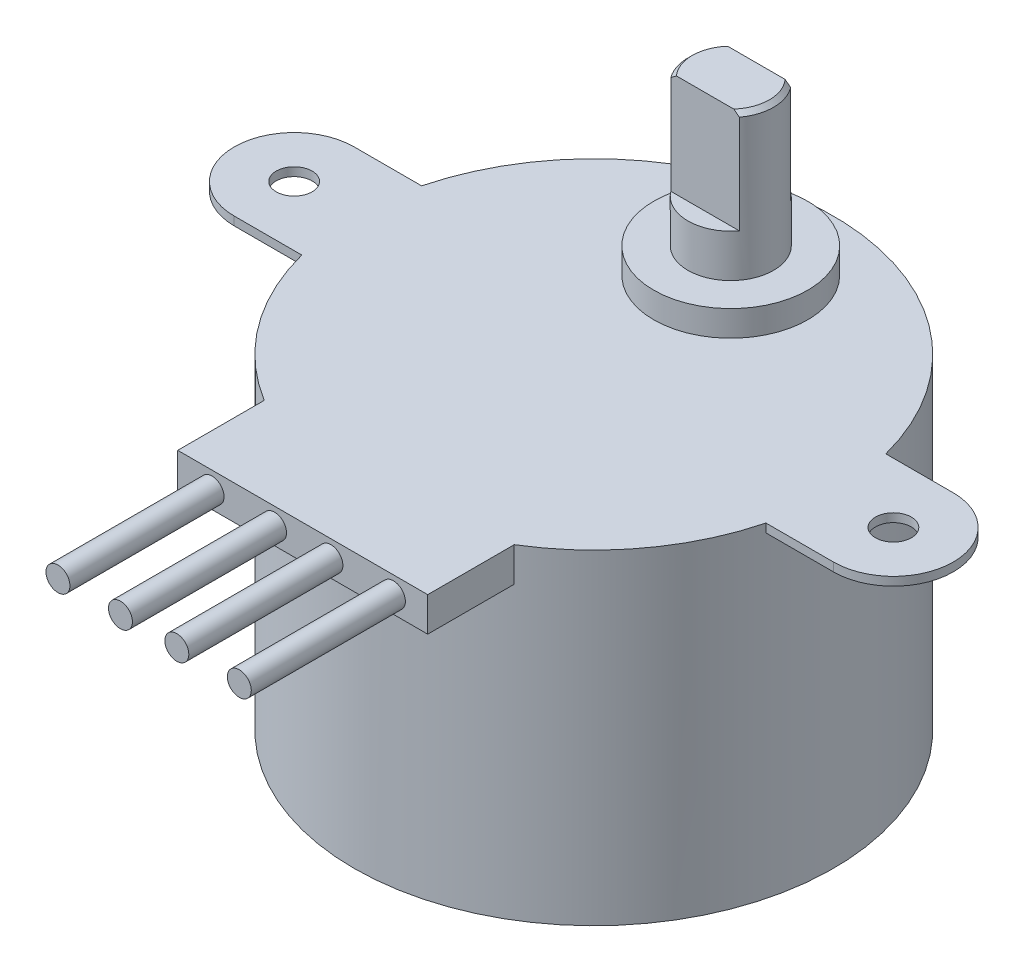
ISO-10303-21;
HEADER;
FILE_DESCRIPTION(('STEP AP214'),'2;1');
FILE_NAME('part.step','',(''),(''),'','','');
FILE_SCHEMA(('AUTOMOTIVE_DESIGN { 1 0 10303 214 1 1 1 1 }'));
ENDSEC;
DATA;
#1=APPLICATION_CONTEXT('core data for automotive mechanical design processes');
#2=APPLICATION_PROTOCOL_DEFINITION('international standard','automotive_design',2000,#1);
#3=PRODUCT_CONTEXT('',#1,'mechanical');
#4=PRODUCT('Part','Part','',(#3));
#5=PRODUCT_RELATED_PRODUCT_CATEGORY('part','',(#4));
#6=PRODUCT_DEFINITION_FORMATION('','',#4);
#7=PRODUCT_DEFINITION_CONTEXT('part definition',#1,'design');
#8=PRODUCT_DEFINITION('design','',#6,#7);
#9=PRODUCT_DEFINITION_SHAPE('','',#8);
#10=(LENGTH_UNIT() NAMED_UNIT(*) SI_UNIT(.MILLI.,.METRE.));
#11=(NAMED_UNIT(*) PLANE_ANGLE_UNIT() SI_UNIT($,.RADIAN.));
#12=(NAMED_UNIT(*) SI_UNIT($,.STERADIAN.) SOLID_ANGLE_UNIT());
#13=UNCERTAINTY_MEASURE_WITH_UNIT(LENGTH_MEASURE(1.E-05),#10,'distance_accuracy_value','');
#14=(GEOMETRIC_REPRESENTATION_CONTEXT(3) GLOBAL_UNCERTAINTY_ASSIGNED_CONTEXT((#13)) GLOBAL_UNIT_ASSIGNED_CONTEXT((#10,
#11,#12)) REPRESENTATION_CONTEXT('',''));
#15=CARTESIAN_POINT('',(0.,0.,0.));
#16=DIRECTION('',(0.,0.,1.));
#17=DIRECTION('',(1.,0.,0.));
#18=AXIS2_PLACEMENT_3D('',#15,#16,#17);
#19=CARTESIAN_POINT('',(0.,29.,-8.));
#20=DIRECTION('',(0.,-1.,0.));
#21=DIRECTION('',(0.,0.,-1.));
#22=AXIS2_PLACEMENT_3D('',#19,#20,#21);
#23=CONICAL_SURFACE('',#22,2.24999999999999,0.785398163397459);
#24=CARTESIAN_POINT('',(-5.29560570992025,25.7460523408249,-9.5));
#25=CARTESIAN_POINT('',(-5.18820658969202,25.849382940986,-9.5));
#26=CARTESIAN_POINT('',(-5.08069402352708,25.9525958192282,-9.5));
#27=CARTESIAN_POINT('',(-4.86538805530175,26.1587301210805,-9.5));
#28=CARTESIAN_POINT('',(-4.75759465073809,26.2616515420755,-9.5));
#29=CARTESIAN_POINT('',(-4.43364697867501,26.5699567070758,-9.5));
#30=CARTESIAN_POINT('',(-4.21699299986283,26.7748160360403,-9.5));
#31=CARTESIAN_POINT('',(-3.78327979432694,27.1809247429067,-9.5));
#32=CARTESIAN_POINT('',(-3.56623509437759,27.382189560473,-9.5));
#33=CARTESIAN_POINT('',(-3.23828667971139,27.6814511852117,-9.5));
#34=CARTESIAN_POINT('',(-3.12858082208436,27.7807594534206,-9.5));
#35=CARTESIAN_POINT('',(-2.90811369864988,27.9781960624543,-9.5));
#36=CARTESIAN_POINT('',(-2.79735245585084,28.0763244288972,-9.5));
#37=CARTESIAN_POINT('',(-2.6060781193075,28.243318134591,-9.5));
#38=CARTESIAN_POINT('',(-2.5259099046565,28.3125780774976,-9.5));
#39=CARTESIAN_POINT('',(-2.36465516134928,28.4500334343891,-9.5));
#40=CARTESIAN_POINT('',(-2.28356857525822,28.5182287811529,-9.5));
#41=CARTESIAN_POINT('',(-2.1198549226414,28.6535315064732,-9.5));
#42=CARTESIAN_POINT('',(-2.037222453965,28.720632368457,-9.5));
#43=CARTESIAN_POINT('',(-1.87045090712276,28.8529174798349,-9.5));
#44=CARTESIAN_POINT('',(-1.78631206308137,28.9181020229777,-9.5));
#45=CARTESIAN_POINT('',(-1.61535890214828,29.0463313053744,-9.5));
#46=CARTESIAN_POINT('',(-1.52852863031956,29.1093549069179,-9.5));
#47=CARTESIAN_POINT('',(-1.35207727598118,29.2315718346744,-9.5));
#48=CARTESIAN_POINT('',(-1.26245405394018,29.2907621119511,-9.5));
#49=CARTESIAN_POINT('',(-1.07992910258383,29.4030903725634,-9.5));
#50=CARTESIAN_POINT('',(-0.987041513790181,29.4562510471553,-9.5));
#51=CARTESIAN_POINT('',(-0.796653981553194,29.5535384191262,-9.5));
#52=CARTESIAN_POINT('',(-0.699162686771165,29.5976812866803,-9.5));
#53=CARTESIAN_POINT('',(-0.54802819699378,29.6537220566097,-9.5));
#54=CARTESIAN_POINT('',(-0.496323268659329,29.6708178403541,-9.5));
#55=CARTESIAN_POINT('',(-0.391626119819821,29.7005316333052,-9.5));
#56=CARTESIAN_POINT('',(-0.338634106406585,29.7131503578371,-9.5));
#57=CARTESIAN_POINT('',(-0.232037646161233,29.7330542925637,-9.5));
#58=CARTESIAN_POINT('',(-0.178440459717219,29.7403776373364,-9.5));
#59=CARTESIAN_POINT('',(-0.0707675976697622,29.7492893819139,-9.5));
#60=CARTESIAN_POINT('',(-0.0166919903199605,29.7508785869609,-9.5));
#61=CARTESIAN_POINT('',(0.0914656977030427,29.7481897112018,-9.5));
#62=CARTESIAN_POINT('',(0.145547348144287,29.7438947126811,-9.5));
#63=CARTESIAN_POINT('',(0.252974148158208,29.7297511472288,-9.5));
#64=CARTESIAN_POINT('',(0.306319141512227,29.7199014203182,-9.5));
#65=CARTESIAN_POINT('',(0.412272630736637,29.6952365228268,-9.5));
#66=CARTESIAN_POINT('',(0.464871941973378,29.6803826272461,-9.5));
#67=CARTESIAN_POINT('',(0.568710881944715,29.6465599429956,-9.5));
#68=CARTESIAN_POINT('',(0.61995043922586,29.6275909385603,-9.5));
#69=CARTESIAN_POINT('',(0.730427189428528,29.5825085207768,-9.5));
#70=CARTESIAN_POINT('',(0.789387325414205,29.555722573537,-9.5));
#71=CARTESIAN_POINT('',(0.905563799626151,29.4985758556907,-9.5));
#72=CARTESIAN_POINT('',(0.962779136826152,29.4682130798141,-9.5));
#73=CARTESIAN_POINT('',(1.0757708274364,29.4047101430363,-9.5));
#74=CARTESIAN_POINT('',(1.13154439115739,29.3715650582906,-9.5));
#75=CARTESIAN_POINT('',(1.24178698411766,29.3031634717541,-9.5));
#76=CARTESIAN_POINT('',(1.29625575153712,29.2679065510899,-9.5));
#77=CARTESIAN_POINT('',(1.45916596850069,29.1589339542868,-9.5));
#78=CARTESIAN_POINT('',(1.56592498003163,29.0827098755891,-9.5));
#79=CARTESIAN_POINT('',(1.7761813912377,28.9262240044225,-9.5));
#80=CARTESIAN_POINT('',(1.87968266356178,28.8459673252073,-9.5));
#81=CARTESIAN_POINT('',(2.05762102669724,28.7040741589505,-9.5));
#82=CARTESIAN_POINT('',(2.13256541352079,28.6430709074266,-9.5));
#83=CARTESIAN_POINT('',(2.28149035208902,28.5198991786782,-9.5));
#84=CARTESIAN_POINT('',(2.35547088679131,28.4577306808976,-9.5));
#85=CARTESIAN_POINT('',(2.57628628595803,28.2698615996696,-9.5));
#86=CARTESIAN_POINT('',(2.72197405035627,28.142814344787,-9.5));
#87=CARTESIAN_POINT('',(3.01147689149766,27.8862923788447,-9.5));
#88=CARTESIAN_POINT('',(3.15528966578232,27.7568150867017,-9.5));
#89=CARTESIAN_POINT('',(3.44147452884157,27.496302974234,-9.5));
#90=CARTESIAN_POINT('',(3.58384673104324,27.3652682783302,-9.5));
#91=CARTESIAN_POINT('',(3.85796590528941,27.1109819086724,-9.5));
#92=CARTESIAN_POINT('',(3.98978048387999,26.9878029598785,-9.5));
#93=CARTESIAN_POINT('',(4.25272725814049,26.7407129081771,-9.5));
#94=CARTESIAN_POINT('',(4.38385943690915,26.6168017872965,-9.5));
#95=CARTESIAN_POINT('',(4.64533491749975,26.3686645561344,-9.5));
#96=CARTESIAN_POINT('',(4.7756792639242,26.2444395455766,-9.5));
#97=CARTESIAN_POINT('',(5.03593786079116,25.9955492166926,-9.5));
#98=CARTESIAN_POINT('',(5.16585212683956,25.8708839146896,-9.5));
#99=CARTESIAN_POINT('',(5.29560570992025,25.7460523408249,-9.5));
#100=B_SPLINE_CURVE_WITH_KNOTS('',3,(#24,#25,#26,#27,#28,#29,#30,#31,#32,#33,#34,#35,#36,#37,
#38,#39,#40,#41,#42,#43,#44,#45,#46,#47,#48,#49,#50,#51,#52,#53,#54,#55,#56,#57,#58,#59,#60,#61,
#62,#63,#64,#65,#66,#67,#68,#69,#70,#71,#72,#73,#74,#75,#76,#77,#78,#79,#80,#81,#82,#83,#84,#85,
#86,#87,#88,#89,#90,#91,#92,#93,#94,#95,#96,#97,#98,#99),.UNSPECIFIED.,.F.,.F.,(4,2,2,2,2,2,2,2,
2,2,2,2,2,2,2,2,2,2,2,2,2,2,2,2,2,2,2,2,2,2,2,2,2,2,2,2,2,4),(0.,0.447108613703141,
0.894221226465639,1.78872876565463,2.67670064303386,3.12062914323221,3.56454798740258,
3.88236949475616,4.20021098960284,4.51952730253651,4.8387944101438,5.16060033890336,
5.48265915833049,5.80346266301834,6.12368577329955,6.28689941569178,6.45008696875854,
6.61208729704362,6.77406487482177,6.93650913407911,7.098987328701,7.2627529088567,
7.42652707772559,7.6206434256806,7.81486912329207,8.00944609630381,8.20406179141897,
8.59740753980443,8.99026653651387,9.28015313371083,9.57004484961505,10.1499089088741,
10.7304282916079,11.3109016043265,11.8521314065165,12.3933745503624,12.9335525857376,
13.4737108005205),.UNSPECIFIED.);
#101=CARTESIAN_POINT('',(-2.00000000000024,28.7499999999999,-9.5));
#102=VERTEX_POINT('',#101);
#103=CARTESIAN_POINT('',(-1.67705098312483,29.,-9.5));
#104=VERTEX_POINT('',#103);
#105=EDGE_CURVE('E480',#102,#104,#100,.T.);
#106=ORIENTED_EDGE('',*,*,#105,.F.);
#107=CARTESIAN_POINT('',(0.,28.75,-8.));
#108=DIRECTION('',(0.,1.,0.));
#109=DIRECTION('',(0.,0.,1.));
#110=AXIS2_PLACEMENT_3D('',#107,#108,#109);
#111=CIRCLE('',#110,2.5);
#112=CARTESIAN_POINT('',(-2.,28.75,-6.5));
#113=VERTEX_POINT('',#112);
#114=EDGE_CURVE('E367',#113,#102,#111,.F.);
#115=ORIENTED_EDGE('',*,*,#114,.F.);
#116=CARTESIAN_POINT('',(5.29560570992025,25.7460523408249,-6.5));
#117=CARTESIAN_POINT('',(5.18820658969202,25.849382940986,-6.5));
#118=CARTESIAN_POINT('',(5.08069402352708,25.9525958192282,-6.5));
#119=CARTESIAN_POINT('',(4.86538805530175,26.1587301210805,-6.5));
#120=CARTESIAN_POINT('',(4.75759465073809,26.2616515420755,-6.5));
#121=CARTESIAN_POINT('',(4.43364697867501,26.5699567070758,-6.5));
#122=CARTESIAN_POINT('',(4.21699299986283,26.7748160360403,-6.5));
#123=CARTESIAN_POINT('',(3.78327979432694,27.1809247429067,-6.5));
#124=CARTESIAN_POINT('',(3.56623509437759,27.382189560473,-6.5));
#125=CARTESIAN_POINT('',(3.23828667971139,27.6814511852117,-6.5));
#126=CARTESIAN_POINT('',(3.12858082208436,27.7807594534206,-6.5));
#127=CARTESIAN_POINT('',(2.90811369864988,27.9781960624543,-6.5));
#128=CARTESIAN_POINT('',(2.79735245585084,28.0763244288972,-6.5));
#129=CARTESIAN_POINT('',(2.6060781193075,28.243318134591,-6.5));
#130=CARTESIAN_POINT('',(2.5259099046565,28.3125780774976,-6.5));
#131=CARTESIAN_POINT('',(2.36465516134928,28.4500334343891,-6.5));
#132=CARTESIAN_POINT('',(2.28356857525822,28.5182287811529,-6.5));
#133=CARTESIAN_POINT('',(2.1198549226414,28.6535315064732,-6.5));
#134=CARTESIAN_POINT('',(2.037222453965,28.720632368457,-6.5));
#135=CARTESIAN_POINT('',(1.87045090712276,28.8529174798349,-6.5));
#136=CARTESIAN_POINT('',(1.78631206308137,28.9181020229777,-6.5));
#137=CARTESIAN_POINT('',(1.61535890214828,29.0463313053744,-6.5));
#138=CARTESIAN_POINT('',(1.52852863031956,29.1093549069179,-6.5));
#139=CARTESIAN_POINT('',(1.35207727598118,29.2315718346744,-6.5));
#140=CARTESIAN_POINT('',(1.26245405394018,29.2907621119511,-6.5));
#141=CARTESIAN_POINT('',(1.07992910258383,29.4030903725634,-6.5));
#142=CARTESIAN_POINT('',(0.987041513790181,29.4562510471553,-6.5));
#143=CARTESIAN_POINT('',(0.796653981553194,29.5535384191262,-6.5));
#144=CARTESIAN_POINT('',(0.699162686771165,29.5976812866803,-6.5));
#145=CARTESIAN_POINT('',(0.54802819699378,29.6537220566097,-6.5));
#146=CARTESIAN_POINT('',(0.496323268659329,29.6708178403541,-6.5));
#147=CARTESIAN_POINT('',(0.391626119819821,29.7005316333052,-6.5));
#148=CARTESIAN_POINT('',(0.338634106406585,29.7131503578371,-6.5));
#149=CARTESIAN_POINT('',(0.232037646161233,29.7330542925637,-6.5));
#150=CARTESIAN_POINT('',(0.178440459717219,29.7403776373364,-6.5));
#151=CARTESIAN_POINT('',(0.0707675976697622,29.7492893819139,-6.5));
#152=CARTESIAN_POINT('',(0.0166919903199605,29.7508785869609,-6.5));
#153=CARTESIAN_POINT('',(-0.0914656977030427,29.7481897112018,-6.5));
#154=CARTESIAN_POINT('',(-0.145547348144287,29.7438947126811,-6.5));
#155=CARTESIAN_POINT('',(-0.252974148158208,29.7297511472288,-6.5));
#156=CARTESIAN_POINT('',(-0.306319141512227,29.7199014203182,-6.5));
#157=CARTESIAN_POINT('',(-0.412272630736637,29.6952365228268,-6.5));
#158=CARTESIAN_POINT('',(-0.464871941973378,29.6803826272461,-6.5));
#159=CARTESIAN_POINT('',(-0.568710881944715,29.6465599429956,-6.5));
#160=CARTESIAN_POINT('',(-0.61995043922586,29.6275909385603,-6.5));
#161=CARTESIAN_POINT('',(-0.730427189428528,29.5825085207768,-6.5));
#162=CARTESIAN_POINT('',(-0.789387325414205,29.555722573537,-6.5));
#163=CARTESIAN_POINT('',(-0.905563799626151,29.4985758556907,-6.5));
#164=CARTESIAN_POINT('',(-0.962779136826152,29.4682130798141,-6.5));
#165=CARTESIAN_POINT('',(-1.0757708274364,29.4047101430363,-6.5));
#166=CARTESIAN_POINT('',(-1.13154439115739,29.3715650582906,-6.5));
#167=CARTESIAN_POINT('',(-1.24178698411766,29.3031634717541,-6.5));
#168=CARTESIAN_POINT('',(-1.29625575153712,29.2679065510899,-6.5));
#169=CARTESIAN_POINT('',(-1.45916596850069,29.1589339542868,-6.5));
#170=CARTESIAN_POINT('',(-1.56592498003163,29.0827098755891,-6.5));
#171=CARTESIAN_POINT('',(-1.7761813912377,28.9262240044225,-6.5));
#172=CARTESIAN_POINT('',(-1.87968266356178,28.8459673252073,-6.5));
#173=CARTESIAN_POINT('',(-2.05762102669724,28.7040741589505,-6.5));
#174=CARTESIAN_POINT('',(-2.13256541352079,28.6430709074266,-6.5));
#175=CARTESIAN_POINT('',(-2.28149035208902,28.5198991786782,-6.5));
#176=CARTESIAN_POINT('',(-2.35547088679131,28.4577306808976,-6.5));
#177=CARTESIAN_POINT('',(-2.57628628595803,28.2698615996696,-6.5));
#178=CARTESIAN_POINT('',(-2.72197405035627,28.142814344787,-6.5));
#179=CARTESIAN_POINT('',(-3.01147689149766,27.8862923788447,-6.5));
#180=CARTESIAN_POINT('',(-3.15528966578232,27.7568150867017,-6.5));
#181=CARTESIAN_POINT('',(-3.44147452884157,27.496302974234,-6.5));
#182=CARTESIAN_POINT('',(-3.58384673104324,27.3652682783302,-6.5));
#183=CARTESIAN_POINT('',(-3.85796590528941,27.1109819086724,-6.5));
#184=CARTESIAN_POINT('',(-3.98978048387999,26.9878029598785,-6.5));
#185=CARTESIAN_POINT('',(-4.25272725814049,26.7407129081771,-6.5));
#186=CARTESIAN_POINT('',(-4.38385943690915,26.6168017872965,-6.5));
#187=CARTESIAN_POINT('',(-4.64533491749975,26.3686645561344,-6.5));
#188=CARTESIAN_POINT('',(-4.7756792639242,26.2444395455766,-6.5));
#189=CARTESIAN_POINT('',(-5.03593786079116,25.9955492166926,-6.5));
#190=CARTESIAN_POINT('',(-5.16585212683956,25.8708839146896,-6.5));
#191=CARTESIAN_POINT('',(-5.29560570992025,25.7460523408249,-6.5));
#192=B_SPLINE_CURVE_WITH_KNOTS('',3,(#116,#117,#118,#119,#120,#121,#122,#123,#124,#125,#126,
#127,#128,#129,#130,#131,#132,#133,#134,#135,#136,#137,#138,#139,#140,#141,#142,#143,#144,#145,
#146,#147,#148,#149,#150,#151,#152,#153,#154,#155,#156,#157,#158,#159,#160,#161,#162,#163,#164,
#165,#166,#167,#168,#169,#170,#171,#172,#173,#174,#175,#176,#177,#178,#179,#180,#181,#182,#183,
#184,#185,#186,#187,#188,#189,#190,#191),.UNSPECIFIED.,.F.,.F.,(4,2,2,2,2,2,2,2,2,2,2,2,2,2,2,2,
2,2,2,2,2,2,2,2,2,2,2,2,2,2,2,2,2,2,2,2,2,4),(0.,0.447108613703141,0.894221226465639,
1.78872876565463,2.67670064303386,3.12062914323221,3.56454798740258,3.88236949475616,
4.20021098960284,4.51952730253651,4.8387944101438,5.16060033890336,5.48265915833049,
5.80346266301834,6.12368577329955,6.28689941569178,6.45008696875854,6.61208729704362,
6.77406487482177,6.93650913407911,7.098987328701,7.2627529088567,7.42652707772559,
7.6206434256806,7.81486912329207,8.00944609630381,8.20406179141897,8.59740753980443,
8.99026653651387,9.28015313371083,9.57004484961505,10.1499089088741,10.7304282916079,
11.3109016043265,11.8521314065165,12.3933745503624,12.9335525857376,13.4737108005205),.UNSPECIFIED.);
#193=CARTESIAN_POINT('',(-1.67705098312483,29.,-6.5));
#194=VERTEX_POINT('',#193);
#195=EDGE_CURVE('E371',#194,#113,#192,.T.);
#196=ORIENTED_EDGE('',*,*,#195,.F.);
#197=CARTESIAN_POINT('',(0.,29.,-8.));
#198=DIRECTION('',(0.,1.,0.));
#199=DIRECTION('',(0.,0.,1.));
#200=AXIS2_PLACEMENT_3D('',#197,#198,#199);
#201=CIRCLE('',#200,2.24999999999999);
#202=EDGE_CURVE('E344',#104,#194,#201,.T.);
#203=ORIENTED_EDGE('',*,*,#202,.F.);
#204=EDGE_LOOP('',(#106,#115,#196,#203));
#205=FACE_BOUND('',#204,.T.);
#206=ADVANCED_FACE('F41',(#205),#23,.T.);
#207=CARTESIAN_POINT('',(0.,19.,0.));
#208=DIRECTION('',(0.,-1.,0.));
#209=DIRECTION('',(0.,0.,-1.));
#210=AXIS2_PLACEMENT_3D('',#207,#208,#209);
#211=CYLINDRICAL_SURFACE('',#210,14.);
#212=CARTESIAN_POINT('',(0.,0.,0.));
#213=DIRECTION('',(0.,1.,0.));
#214=DIRECTION('',(0.,0.,1.));
#215=AXIS2_PLACEMENT_3D('',#212,#213,#214);
#216=CIRCLE('',#215,14.);
#217=CARTESIAN_POINT('',(0.,0.,14.));
#218=VERTEX_POINT('',#217);
#219=EDGE_CURVE('E350',#218,#218,#216,.T.);
#220=ORIENTED_EDGE('',*,*,#219,.T.);
#221=EDGE_LOOP('',(#220));
#222=FACE_BOUND('',#221,.T.);
#223=CARTESIAN_POINT('',(0.,17.,0.));
#224=DIRECTION('',(0.,-1.,0.));
#225=DIRECTION('',(0.,0.,-1.));
#226=AXIS2_PLACEMENT_3D('',#223,#224,#225);
#227=CIRCLE('',#226,14.);
#228=CARTESIAN_POINT('',(7.3,17.,11.9461290801665));
#229=VERTEX_POINT('',#228);
#230=CARTESIAN_POINT('',(-7.3,17.,11.9461290801665));
#231=VERTEX_POINT('',#230);
#232=EDGE_CURVE('E467',#229,#231,#227,.T.);
#233=ORIENTED_EDGE('',*,*,#232,.T.);
#234=DIRECTION('',(0.,-1.,0.));
#235=VECTOR('',#234,1.);
#236=CARTESIAN_POINT('',(-7.3,19.,11.9461290801665));
#237=LINE('',#236,#235);
#238=CARTESIAN_POINT('',(-7.3,19.,11.9461290801665));
#239=VERTEX_POINT('',#238);
#240=EDGE_CURVE('E175',#231,#239,#237,.F.);
#241=ORIENTED_EDGE('',*,*,#240,.T.);
#242=CARTESIAN_POINT('',(0.,19.,0.));
#243=DIRECTION('',(0.,1.,0.));
#244=DIRECTION('',(0.,0.,1.));
#245=AXIS2_PLACEMENT_3D('',#242,#243,#244);
#246=CIRCLE('',#245,14.);
#247=CARTESIAN_POINT('',(-13.555441711726,19.,3.5));
#248=VERTEX_POINT('',#247);
#249=EDGE_CURVE('E345',#248,#239,#246,.T.);
#250=ORIENTED_EDGE('',*,*,#249,.F.);
#251=DIRECTION('',(0.,1.,0.));
#252=VECTOR('',#251,1.);
#253=CARTESIAN_POINT('',(-13.555441711726,18.5,3.5));
#254=LINE('',#253,#252);
#255=CARTESIAN_POINT('',(-13.555441711726,18.5,3.5));
#256=VERTEX_POINT('',#255);
#257=EDGE_CURVE('E333',#256,#248,#254,.T.);
#258=ORIENTED_EDGE('',*,*,#257,.F.);
#259=CARTESIAN_POINT('',(0.,18.5,0.));
#260=DIRECTION('',(0.,1.,0.));
#261=DIRECTION('',(0.,0.,1.));
#262=AXIS2_PLACEMENT_3D('',#259,#260,#261);
#263=CIRCLE('',#262,14.);
#264=CARTESIAN_POINT('',(-13.555441711726,18.5,-3.5));
#265=VERTEX_POINT('',#264);
#266=EDGE_CURVE('E300',#265,#256,#263,.T.);
#267=ORIENTED_EDGE('',*,*,#266,.F.);
#268=DIRECTION('',(0.,1.,0.));
#269=VECTOR('',#268,1.);
#270=CARTESIAN_POINT('',(-13.555441711726,18.5,-3.5));
#271=LINE('',#270,#269);
#272=CARTESIAN_POINT('',(-13.555441711726,19.,-3.5));
#273=VERTEX_POINT('',#272);
#274=EDGE_CURVE('E329',#265,#273,#271,.T.);
#275=ORIENTED_EDGE('',*,*,#274,.T.);
#276=CARTESIAN_POINT('',(13.555441711726,19.,-3.5));
#277=VERTEX_POINT('',#276);
#278=EDGE_CURVE('E358',#277,#273,#246,.T.);
#279=ORIENTED_EDGE('',*,*,#278,.F.);
#280=DIRECTION('',(0.,1.,0.));
#281=VECTOR('',#280,1.);
#282=CARTESIAN_POINT('',(13.555441711726,18.5,-3.5));
#283=LINE('',#282,#281);
#284=CARTESIAN_POINT('',(13.555441711726,18.5,-3.5));
#285=VERTEX_POINT('',#284);
#286=EDGE_CURVE('E283',#285,#277,#283,.T.);
#287=ORIENTED_EDGE('',*,*,#286,.F.);
#288=CARTESIAN_POINT('',(0.,18.5,0.));
#289=DIRECTION('',(0.,1.,0.));
#290=DIRECTION('',(0.,0.,1.));
#291=AXIS2_PLACEMENT_3D('',#288,#289,#290);
#292=CIRCLE('',#291,14.);
#293=CARTESIAN_POINT('',(13.555441711726,18.5,3.5));
#294=VERTEX_POINT('',#293);
#295=EDGE_CURVE('E260',#294,#285,#292,.T.);
#296=ORIENTED_EDGE('',*,*,#295,.F.);
#297=DIRECTION('',(0.,1.,0.));
#298=VECTOR('',#297,1.);
#299=CARTESIAN_POINT('',(13.555441711726,18.5,3.5));
#300=LINE('',#299,#298);
#301=CARTESIAN_POINT('',(13.555441711726,19.,3.5));
#302=VERTEX_POINT('',#301);
#303=EDGE_CURVE('E278',#294,#302,#300,.T.);
#304=ORIENTED_EDGE('',*,*,#303,.T.);
#305=CARTESIAN_POINT('',(7.3,19.,11.9461290801665));
#306=VERTEX_POINT('',#305);
#307=EDGE_CURVE('E357',#306,#302,#246,.T.);
#308=ORIENTED_EDGE('',*,*,#307,.F.);
#309=DIRECTION('',(0.,-1.,0.));
#310=VECTOR('',#309,1.);
#311=CARTESIAN_POINT('',(7.3,19.,11.9461290801665));
#312=LINE('',#311,#310);
#313=EDGE_CURVE('E208',#306,#229,#312,.T.);
#314=ORIENTED_EDGE('',*,*,#313,.T.);
#315=EDGE_LOOP('',(#233,#241,#250,#258,#267,#275,#279,#287,#296,#304,#308,#314));
#316=FACE_BOUND('',#315,.T.);
#317=ADVANCED_FACE('F454',(#222,#316),#211,.T.);
#318=CARTESIAN_POINT('',(0.,19.,0.));
#319=DIRECTION('',(0.,1.,0.));
#320=DIRECTION('',(0.,0.,1.));
#321=AXIS2_PLACEMENT_3D('',#318,#319,#320);
#322=PLANE('',#321);
#323=ORIENTED_EDGE('',*,*,#249,.T.);
#324=DIRECTION('',(0.,0.,1.));
#325=VECTOR('',#324,1.);
#326=CARTESIAN_POINT('',(-7.3,19.,0.));
#327=LINE('',#326,#325);
#328=CARTESIAN_POINT('',(-7.3,19.,17.));
#329=VERTEX_POINT('',#328);
#330=EDGE_CURVE('E199',#239,#329,#327,.T.);
#331=ORIENTED_EDGE('',*,*,#330,.T.);
#332=DIRECTION('',(1.,0.,0.));
#333=VECTOR('',#332,1.);
#334=CARTESIAN_POINT('',(7.3,19.,17.));
#335=LINE('',#334,#333);
#336=CARTESIAN_POINT('',(7.3,19.,17.));
#337=VERTEX_POINT('',#336);
#338=EDGE_CURVE('E185',#329,#337,#335,.T.);
#339=ORIENTED_EDGE('',*,*,#338,.T.);
#340=DIRECTION('',(0.,0.,-1.));
#341=VECTOR('',#340,1.);
#342=CARTESIAN_POINT('',(7.3,19.,0.));
#343=LINE('',#342,#341);
#344=EDGE_CURVE('E58',#337,#306,#343,.T.);
#345=ORIENTED_EDGE('',*,*,#344,.T.);
#346=ORIENTED_EDGE('',*,*,#307,.T.);
#347=DIRECTION('',(-1.,0.,0.));
#348=VECTOR('',#347,1.);
#349=CARTESIAN_POINT('',(0.,19.,3.5));
#350=LINE('',#349,#348);
#351=CARTESIAN_POINT('',(17.5,19.,3.5));
#352=VERTEX_POINT('',#351);
#353=EDGE_CURVE('E267',#352,#302,#350,.T.);
#354=ORIENTED_EDGE('',*,*,#353,.F.);
#355=CARTESIAN_POINT('',(17.5,19.,0.));
#356=DIRECTION('',(0.,1.,0.));
#357=DIRECTION('',(0.,0.,1.));
#358=AXIS2_PLACEMENT_3D('',#355,#356,#357);
#359=CIRCLE('',#358,3.5);
#360=CARTESIAN_POINT('',(17.5,19.,-3.5));
#361=VERTEX_POINT('',#360);
#362=EDGE_CURVE('E271',#352,#361,#359,.T.);
#363=ORIENTED_EDGE('',*,*,#362,.T.);
#364=DIRECTION('',(1.,0.,0.));
#365=VECTOR('',#364,1.);
#366=CARTESIAN_POINT('',(0.,19.,-3.5));
#367=LINE('',#366,#365);
#368=EDGE_CURVE('E250',#277,#361,#367,.T.);
#369=ORIENTED_EDGE('',*,*,#368,.F.);
#370=ORIENTED_EDGE('',*,*,#278,.T.);
#371=DIRECTION('',(1.,0.,0.));
#372=VECTOR('',#371,1.);
#373=CARTESIAN_POINT('',(0.,19.,-3.5));
#374=LINE('',#373,#372);
#375=CARTESIAN_POINT('',(-17.5,19.,-3.5));
#376=VERTEX_POINT('',#375);
#377=EDGE_CURVE('E317',#376,#273,#374,.T.);
#378=ORIENTED_EDGE('',*,*,#377,.F.);
#379=CARTESIAN_POINT('',(-17.5,19.,0.));
#380=DIRECTION('',(0.,1.,0.));
#381=DIRECTION('',(0.,0.,1.));
#382=AXIS2_PLACEMENT_3D('',#379,#380,#381);
#383=CIRCLE('',#382,3.5);
#384=CARTESIAN_POINT('',(-17.5,19.,3.5));
#385=VERTEX_POINT('',#384);
#386=EDGE_CURVE('E282',#385,#376,#383,.F.);
#387=ORIENTED_EDGE('',*,*,#386,.F.);
#388=DIRECTION('',(-1.,0.,0.));
#389=VECTOR('',#388,1.);
#390=CARTESIAN_POINT('',(0.,19.,3.5));
#391=LINE('',#390,#389);
#392=EDGE_CURVE('E314',#248,#385,#391,.T.);
#393=ORIENTED_EDGE('',*,*,#392,.F.);
#394=EDGE_LOOP('',(#323,#331,#339,#345,#346,#354,#363,#369,#370,#378,#387,#393));
#395=FACE_BOUND('',#394,.T.);
#396=CARTESIAN_POINT('',(0.,19.,-8.));
#397=DIRECTION('',(0.,1.,0.));
#398=DIRECTION('',(0.,0.,1.));
#399=AXIS2_PLACEMENT_3D('',#396,#397,#398);
#400=CIRCLE('',#399,4.5);
#401=CARTESIAN_POINT('',(0.,19.,-3.5));
#402=VERTEX_POINT('',#401);
#403=EDGE_CURVE('E328',#402,#402,#400,.T.);
#404=ORIENTED_EDGE('',*,*,#403,.F.);
#405=EDGE_LOOP('',(#404));
#406=FACE_BOUND('',#405,.T.);
#407=CARTESIAN_POINT('',(-17.5,19.,0.));
#408=DIRECTION('',(0.,1.,0.));
#409=DIRECTION('',(0.,0.,1.));
#410=AXIS2_PLACEMENT_3D('',#407,#408,#409);
#411=CIRCLE('',#410,1.05);
#412=CARTESIAN_POINT('',(-17.5,19.,1.05));
#413=VERTEX_POINT('',#412);
#414=EDGE_CURVE('E297',#413,#413,#411,.F.);
#415=ORIENTED_EDGE('',*,*,#414,.T.);
#416=EDGE_LOOP('',(#415));
#417=FACE_BOUND('',#416,.T.);
#418=CARTESIAN_POINT('',(17.5,19.,0.));
#419=DIRECTION('',(0.,1.,0.));
#420=DIRECTION('',(0.,0.,1.));
#421=AXIS2_PLACEMENT_3D('',#418,#419,#420);
#422=CIRCLE('',#421,1.05);
#423=CARTESIAN_POINT('',(17.5,19.,1.05));
#424=VERTEX_POINT('',#423);
#425=EDGE_CURVE('E244',#424,#424,#422,.T.);
#426=ORIENTED_EDGE('',*,*,#425,.F.);
#427=EDGE_LOOP('',(#426));
#428=FACE_BOUND('',#427,.T.);
#429=ADVANCED_FACE('F451',(#395,#406,#417,#428),#322,.T.);
#430=CARTESIAN_POINT('',(0.,0.,0.));
#431=DIRECTION('',(0.,1.,0.));
#432=DIRECTION('',(0.,0.,1.));
#433=AXIS2_PLACEMENT_3D('',#430,#431,#432);
#434=PLANE('',#433);
#435=ORIENTED_EDGE('',*,*,#219,.F.);
#436=EDGE_LOOP('',(#435));
#437=FACE_BOUND('',#436,.T.);
#438=ADVANCED_FACE('F449',(#437),#434,.F.);
#439=CARTESIAN_POINT('',(0.,20.5,-8.));
#440=DIRECTION('',(0.,-1.,0.));
#441=DIRECTION('',(0.,0.,-1.));
#442=AXIS2_PLACEMENT_3D('',#439,#440,#441);
#443=CYLINDRICAL_SURFACE('',#442,4.5);
#444=CARTESIAN_POINT('',(0.,20.5,-8.));
#445=DIRECTION('',(0.,1.,0.));
#446=DIRECTION('',(0.,0.,1.));
#447=AXIS2_PLACEMENT_3D('',#444,#445,#446);
#448=CIRCLE('',#447,4.5);
#449=CARTESIAN_POINT('',(0.,20.5,-3.5));
#450=VERTEX_POINT('',#449);
#451=EDGE_CURVE('E346',#450,#450,#448,.T.);
#452=ORIENTED_EDGE('',*,*,#451,.F.);
#453=EDGE_LOOP('',(#452));
#454=FACE_BOUND('',#453,.T.);
#455=ORIENTED_EDGE('',*,*,#403,.T.);
#456=EDGE_LOOP('',(#455));
#457=FACE_BOUND('',#456,.T.);
#458=ADVANCED_FACE('F445',(#454,#457),#443,.T.);
#459=CARTESIAN_POINT('',(0.,20.5,-8.));
#460=DIRECTION('',(0.,1.,0.));
#461=DIRECTION('',(0.,0.,1.));
#462=AXIS2_PLACEMENT_3D('',#459,#460,#461);
#463=PLANE('',#462);
#464=CARTESIAN_POINT('',(0.,20.5,-8.));
#465=DIRECTION('',(0.,1.,0.));
#466=DIRECTION('',(0.,0.,1.));
#467=AXIS2_PLACEMENT_3D('',#464,#465,#466);
#468=CIRCLE('',#467,2.5);
#469=CARTESIAN_POINT('',(0.,20.5,-5.5));
#470=VERTEX_POINT('',#469);
#471=EDGE_CURVE('E340',#470,#470,#468,.T.);
#472=ORIENTED_EDGE('',*,*,#471,.F.);
#473=EDGE_LOOP('',(#472));
#474=FACE_BOUND('',#473,.T.);
#475=ORIENTED_EDGE('',*,*,#451,.T.);
#476=EDGE_LOOP('',(#475));
#477=FACE_BOUND('',#476,.T.);
#478=ADVANCED_FACE('F441',(#474,#477),#463,.T.);
#479=CARTESIAN_POINT('',(0.,23.,-8.));
#480=DIRECTION('',(0.,-1.,0.));
#481=DIRECTION('',(0.,0.,-1.));
#482=AXIS2_PLACEMENT_3D('',#479,#480,#481);
#483=CYLINDRICAL_SURFACE('',#482,2.5);
#484=ORIENTED_EDGE('',*,*,#114,.T.);
#485=DIRECTION('',(0.,-1.,0.));
#486=VECTOR('',#485,1.);
#487=CARTESIAN_POINT('',(-2.,23.,-9.5));
#488=LINE('',#487,#486);
#489=CARTESIAN_POINT('',(-2.,23.,-9.5));
#490=VERTEX_POINT('',#489);
#491=EDGE_CURVE('E240',#102,#490,#488,.T.);
#492=ORIENTED_EDGE('',*,*,#491,.T.);
#493=CARTESIAN_POINT('',(0.,23.,-8.));
#494=DIRECTION('',(0.,-1.,0.));
#495=DIRECTION('',(0.,0.,-1.));
#496=AXIS2_PLACEMENT_3D('',#493,#494,#495);
#497=CIRCLE('',#496,2.5);
#498=CARTESIAN_POINT('',(2.,23.,-9.5));
#499=VERTEX_POINT('',#498);
#500=EDGE_CURVE('E471',#490,#499,#497,.T.);
#501=ORIENTED_EDGE('',*,*,#500,.T.);
#502=DIRECTION('',(0.,-1.,0.));
#503=VECTOR('',#502,1.);
#504=CARTESIAN_POINT('',(2.,23.,-9.5));
#505=LINE('',#504,#503);
#506=CARTESIAN_POINT('',(2.,28.75,-9.5));
#507=VERTEX_POINT('',#506);
#508=EDGE_CURVE('E236',#499,#507,#505,.F.);
#509=ORIENTED_EDGE('',*,*,#508,.T.);
#510=CARTESIAN_POINT('',(2.00000000000024,28.7499999999999,-6.5));
#511=VERTEX_POINT('',#510);
#512=EDGE_CURVE('E366',#507,#511,#111,.F.);
#513=ORIENTED_EDGE('',*,*,#512,.T.);
#514=DIRECTION('',(0.,-1.,0.));
#515=VECTOR('',#514,1.);
#516=CARTESIAN_POINT('',(2.,23.,-6.5));
#517=LINE('',#516,#515);
#518=CARTESIAN_POINT('',(2.,23.,-6.5));
#519=VERTEX_POINT('',#518);
#520=EDGE_CURVE('E232',#511,#519,#517,.T.);
#521=ORIENTED_EDGE('',*,*,#520,.T.);
#522=CARTESIAN_POINT('',(0.,23.,-8.));
#523=DIRECTION('',(0.,1.,0.));
#524=DIRECTION('',(0.,0.,1.));
#525=AXIS2_PLACEMENT_3D('',#522,#523,#524);
#526=CIRCLE('',#525,2.5);
#527=CARTESIAN_POINT('',(-2.,23.,-6.5));
#528=VERTEX_POINT('',#527);
#529=EDGE_CURVE('E477',#528,#519,#526,.T.);
#530=ORIENTED_EDGE('',*,*,#529,.F.);
#531=DIRECTION('',(0.,-1.,0.));
#532=VECTOR('',#531,1.);
#533=CARTESIAN_POINT('',(-2.,23.,-6.5));
#534=LINE('',#533,#532);
#535=EDGE_CURVE('E219',#528,#113,#534,.F.);
#536=ORIENTED_EDGE('',*,*,#535,.T.);
#537=EDGE_LOOP('',(#484,#492,#501,#509,#513,#521,#530,#536));
#538=FACE_BOUND('',#537,.T.);
#539=ORIENTED_EDGE('',*,*,#471,.T.);
#540=EDGE_LOOP('',(#539));
#541=FACE_BOUND('',#540,.T.);
#542=ADVANCED_FACE('F437',(#538,#541),#483,.T.);
#543=CARTESIAN_POINT('',(0.,29.,-8.));
#544=DIRECTION('',(0.,1.,0.));
#545=DIRECTION('',(0.,0.,1.));
#546=AXIS2_PLACEMENT_3D('',#543,#544,#545);
#547=PLANE('',#546);
#548=DIRECTION('',(1.,0.,0.));
#549=VECTOR('',#548,1.);
#550=CARTESIAN_POINT('',(0.,29.,-9.5));
#551=LINE('',#550,#549);
#552=CARTESIAN_POINT('',(1.67705098312483,29.,-9.5));
#553=VERTEX_POINT('',#552);
#554=EDGE_CURVE('E220',#104,#553,#551,.T.);
#555=ORIENTED_EDGE('',*,*,#554,.F.);
#556=ORIENTED_EDGE('',*,*,#202,.T.);
#557=DIRECTION('',(-1.,0.,0.));
#558=VECTOR('',#557,1.);
#559=CARTESIAN_POINT('',(0.,29.,-6.5));
#560=LINE('',#559,#558);
#561=CARTESIAN_POINT('',(1.67705098312483,29.,-6.5));
#562=VERTEX_POINT('',#561);
#563=EDGE_CURVE('E66',#562,#194,#560,.T.);
#564=ORIENTED_EDGE('',*,*,#563,.F.);
#565=EDGE_CURVE('E362',#562,#553,#201,.T.);
#566=ORIENTED_EDGE('',*,*,#565,.T.);
#567=EDGE_LOOP('',(#555,#556,#564,#566));
#568=FACE_BOUND('',#567,.T.);
#569=ADVANCED_FACE('F434',(#568),#547,.T.);
#570=EDGE_CURVE('E380',#553,#507,#100,.T.);
#571=ORIENTED_EDGE('',*,*,#570,.F.);
#572=ORIENTED_EDGE('',*,*,#565,.F.);
#573=EDGE_CURVE('E379',#511,#562,#192,.T.);
#574=ORIENTED_EDGE('',*,*,#573,.F.);
#575=ORIENTED_EDGE('',*,*,#512,.F.);
#576=EDGE_LOOP('',(#571,#572,#574,#575));
#577=FACE_BOUND('',#576,.T.);
#578=ADVANCED_FACE('F43',(#577),#23,.T.);
#579=CARTESIAN_POINT('',(-17.5,18.5,0.));
#580=DIRECTION('',(0.,1.,0.));
#581=DIRECTION('',(0.,0.,1.));
#582=AXIS2_PLACEMENT_3D('',#579,#580,#581);
#583=CYLINDRICAL_SURFACE('',#582,3.5);
#584=ORIENTED_EDGE('',*,*,#386,.T.);
#585=DIRECTION('',(0.,1.,0.));
#586=VECTOR('',#585,1.);
#587=CARTESIAN_POINT('',(-17.5,18.5,-3.5));
#588=LINE('',#587,#586);
#589=CARTESIAN_POINT('',(-17.5,18.5,-3.5));
#590=VERTEX_POINT('',#589);
#591=EDGE_CURVE('E324',#590,#376,#588,.T.);
#592=ORIENTED_EDGE('',*,*,#591,.F.);
#593=CARTESIAN_POINT('',(-17.5,18.5,0.));
#594=DIRECTION('',(0.,1.,0.));
#595=DIRECTION('',(0.,0.,1.));
#596=AXIS2_PLACEMENT_3D('',#593,#594,#595);
#597=CIRCLE('',#596,3.5);
#598=CARTESIAN_POINT('',(-17.5,18.5,3.5));
#599=VERTEX_POINT('',#598);
#600=EDGE_CURVE('E292',#599,#590,#597,.F.);
#601=ORIENTED_EDGE('',*,*,#600,.F.);
#602=DIRECTION('',(0.,1.,0.));
#603=VECTOR('',#602,1.);
#604=CARTESIAN_POINT('',(-17.5,18.5,3.5));
#605=LINE('',#604,#603);
#606=EDGE_CURVE('E310',#599,#385,#605,.T.);
#607=ORIENTED_EDGE('',*,*,#606,.T.);
#608=EDGE_LOOP('',(#584,#592,#601,#607));
#609=FACE_BOUND('',#608,.T.);
#610=ADVANCED_FACE('F426',(#609),#583,.T.);
#611=CARTESIAN_POINT('',(0.,18.5,-3.5));
#612=DIRECTION('',(0.,0.,1.));
#613=DIRECTION('',(1.,0.,0.));
#614=AXIS2_PLACEMENT_3D('',#611,#612,#613);
#615=PLANE('',#614);
#616=ORIENTED_EDGE('',*,*,#377,.T.);
#617=ORIENTED_EDGE('',*,*,#274,.F.);
#618=DIRECTION('',(1.,0.,0.));
#619=VECTOR('',#618,1.);
#620=CARTESIAN_POINT('',(0.,18.5,-3.5));
#621=LINE('',#620,#619);
#622=EDGE_CURVE('E303',#590,#265,#621,.T.);
#623=ORIENTED_EDGE('',*,*,#622,.F.);
#624=ORIENTED_EDGE('',*,*,#591,.T.);
#625=EDGE_LOOP('',(#616,#617,#623,#624));
#626=FACE_BOUND('',#625,.T.);
#627=ADVANCED_FACE('F423',(#626),#615,.F.);
#628=CARTESIAN_POINT('',(0.,18.5,3.5));
#629=DIRECTION('',(0.,0.,-1.));
#630=DIRECTION('',(-1.,0.,0.));
#631=AXIS2_PLACEMENT_3D('',#628,#629,#630);
#632=PLANE('',#631);
#633=ORIENTED_EDGE('',*,*,#392,.T.);
#634=ORIENTED_EDGE('',*,*,#606,.F.);
#635=DIRECTION('',(-1.,0.,0.));
#636=VECTOR('',#635,1.);
#637=CARTESIAN_POINT('',(0.,18.5,3.5));
#638=LINE('',#637,#636);
#639=EDGE_CURVE('E296',#256,#599,#638,.T.);
#640=ORIENTED_EDGE('',*,*,#639,.F.);
#641=ORIENTED_EDGE('',*,*,#257,.T.);
#642=EDGE_LOOP('',(#633,#634,#640,#641));
#643=FACE_BOUND('',#642,.T.);
#644=ADVANCED_FACE('F421',(#643),#632,.F.);
#645=CARTESIAN_POINT('',(-17.5,18.5,0.));
#646=DIRECTION('',(0.,1.,0.));
#647=DIRECTION('',(0.,0.,1.));
#648=AXIS2_PLACEMENT_3D('',#645,#646,#647);
#649=CYLINDRICAL_SURFACE('',#648,1.05);
#650=CARTESIAN_POINT('',(-17.5,18.5,0.));
#651=DIRECTION('',(0.,1.,0.));
#652=DIRECTION('',(0.,0.,1.));
#653=AXIS2_PLACEMENT_3D('',#650,#651,#652);
#654=CIRCLE('',#653,1.05);
#655=CARTESIAN_POINT('',(-17.5,18.5,1.05));
#656=VERTEX_POINT('',#655);
#657=EDGE_CURVE('E306',#656,#656,#654,.F.);
#658=ORIENTED_EDGE('',*,*,#657,.T.);
#659=EDGE_LOOP('',(#658));
#660=FACE_BOUND('',#659,.T.);
#661=ORIENTED_EDGE('',*,*,#414,.F.);
#662=EDGE_LOOP('',(#661));
#663=FACE_BOUND('',#662,.T.);
#664=ADVANCED_FACE('F417',(#660,#663),#649,.F.);
#665=CARTESIAN_POINT('',(0.,18.5,0.));
#666=DIRECTION('',(0.,1.,0.));
#667=DIRECTION('',(0.,0.,1.));
#668=AXIS2_PLACEMENT_3D('',#665,#666,#667);
#669=PLANE('',#668);
#670=ORIENTED_EDGE('',*,*,#600,.T.);
#671=ORIENTED_EDGE('',*,*,#622,.T.);
#672=ORIENTED_EDGE('',*,*,#266,.T.);
#673=ORIENTED_EDGE('',*,*,#639,.T.);
#674=EDGE_LOOP('',(#670,#671,#672,#673));
#675=FACE_BOUND('',#674,.T.);
#676=ORIENTED_EDGE('',*,*,#657,.F.);
#677=EDGE_LOOP('',(#676));
#678=FACE_BOUND('',#677,.T.);
#679=ADVANCED_FACE('F410',(#675,#678),#669,.F.);
#680=CARTESIAN_POINT('',(0.,18.5,3.5));
#681=DIRECTION('',(0.,0.,-1.));
#682=DIRECTION('',(-1.,0.,0.));
#683=AXIS2_PLACEMENT_3D('',#680,#681,#682);
#684=PLANE('',#683);
#685=ORIENTED_EDGE('',*,*,#353,.T.);
#686=ORIENTED_EDGE('',*,*,#303,.F.);
#687=DIRECTION('',(-1.,0.,0.));
#688=VECTOR('',#687,1.);
#689=CARTESIAN_POINT('',(0.,18.5,3.5));
#690=LINE('',#689,#688);
#691=CARTESIAN_POINT('',(17.5,18.5,3.5));
#692=VERTEX_POINT('',#691);
#693=EDGE_CURVE('E249',#692,#294,#690,.T.);
#694=ORIENTED_EDGE('',*,*,#693,.F.);
#695=DIRECTION('',(0.,1.,0.));
#696=VECTOR('',#695,1.);
#697=CARTESIAN_POINT('',(17.5,18.5,3.5));
#698=LINE('',#697,#696);
#699=EDGE_CURVE('E263',#692,#352,#698,.T.);
#700=ORIENTED_EDGE('',*,*,#699,.T.);
#701=EDGE_LOOP('',(#685,#686,#694,#700));
#702=FACE_BOUND('',#701,.T.);
#703=ADVANCED_FACE('F403',(#702),#684,.F.);
#704=CARTESIAN_POINT('',(0.,18.5,-3.5));
#705=DIRECTION('',(0.,0.,1.));
#706=DIRECTION('',(1.,0.,0.));
#707=AXIS2_PLACEMENT_3D('',#704,#705,#706);
#708=PLANE('',#707);
#709=ORIENTED_EDGE('',*,*,#368,.T.);
#710=DIRECTION('',(0.,1.,0.));
#711=VECTOR('',#710,1.);
#712=CARTESIAN_POINT('',(17.5,18.5,-3.5));
#713=LINE('',#712,#711);
#714=CARTESIAN_POINT('',(17.5,18.5,-3.5));
#715=VERTEX_POINT('',#714);
#716=EDGE_CURVE('E287',#715,#361,#713,.T.);
#717=ORIENTED_EDGE('',*,*,#716,.F.);
#718=DIRECTION('',(1.,0.,0.));
#719=VECTOR('',#718,1.);
#720=CARTESIAN_POINT('',(0.,18.5,-3.5));
#721=LINE('',#720,#719);
#722=EDGE_CURVE('E257',#285,#715,#721,.T.);
#723=ORIENTED_EDGE('',*,*,#722,.F.);
#724=ORIENTED_EDGE('',*,*,#286,.T.);
#725=EDGE_LOOP('',(#709,#717,#723,#724));
#726=FACE_BOUND('',#725,.T.);
#727=ADVANCED_FACE('F399',(#726),#708,.F.);
#728=CARTESIAN_POINT('',(17.5,18.5,0.));
#729=DIRECTION('',(0.,1.,0.));
#730=DIRECTION('',(0.,0.,1.));
#731=AXIS2_PLACEMENT_3D('',#728,#729,#730);
#732=CYLINDRICAL_SURFACE('',#731,1.05);
#733=CARTESIAN_POINT('',(17.5,18.5,0.));
#734=DIRECTION('',(0.,1.,0.));
#735=DIRECTION('',(0.,0.,1.));
#736=AXIS2_PLACEMENT_3D('',#733,#734,#735);
#737=CIRCLE('',#736,1.05);
#738=CARTESIAN_POINT('',(17.5,18.5,1.05));
#739=VERTEX_POINT('',#738);
#740=EDGE_CURVE('E245',#739,#739,#737,.T.);
#741=ORIENTED_EDGE('',*,*,#740,.F.);
#742=EDGE_LOOP('',(#741));
#743=FACE_BOUND('',#742,.T.);
#744=ORIENTED_EDGE('',*,*,#425,.T.);
#745=EDGE_LOOP('',(#744));
#746=FACE_BOUND('',#745,.T.);
#747=ADVANCED_FACE('F402',(#743,#746),#732,.F.);
#748=CARTESIAN_POINT('',(17.5,18.5,0.));
#749=DIRECTION('',(0.,1.,0.));
#750=DIRECTION('',(0.,0.,1.));
#751=AXIS2_PLACEMENT_3D('',#748,#749,#750);
#752=CYLINDRICAL_SURFACE('',#751,3.5);
#753=ORIENTED_EDGE('',*,*,#362,.F.);
#754=ORIENTED_EDGE('',*,*,#699,.F.);
#755=CARTESIAN_POINT('',(17.5,18.5,0.));
#756=DIRECTION('',(0.,1.,0.));
#757=DIRECTION('',(0.,0.,1.));
#758=AXIS2_PLACEMENT_3D('',#755,#756,#757);
#759=CIRCLE('',#758,3.5);
#760=EDGE_CURVE('E253',#692,#715,#759,.T.);
#761=ORIENTED_EDGE('',*,*,#760,.T.);
#762=ORIENTED_EDGE('',*,*,#716,.T.);
#763=EDGE_LOOP('',(#753,#754,#761,#762));
#764=FACE_BOUND('',#763,.T.);
#765=ADVANCED_FACE('F397',(#764),#752,.T.);
#766=CARTESIAN_POINT('',(0.,18.5,0.));
#767=DIRECTION('',(0.,1.,0.));
#768=DIRECTION('',(0.,0.,1.));
#769=AXIS2_PLACEMENT_3D('',#766,#767,#768);
#770=PLANE('',#769);
#771=ORIENTED_EDGE('',*,*,#740,.T.);
#772=EDGE_LOOP('',(#771));
#773=FACE_BOUND('',#772,.T.);
#774=ORIENTED_EDGE('',*,*,#693,.T.);
#775=ORIENTED_EDGE('',*,*,#295,.T.);
#776=ORIENTED_EDGE('',*,*,#722,.T.);
#777=ORIENTED_EDGE('',*,*,#760,.F.);
#778=EDGE_LOOP('',(#774,#775,#776,#777));
#779=FACE_BOUND('',#778,.T.);
#780=ADVANCED_FACE('F394',(#773,#779),#770,.F.);
#781=CARTESIAN_POINT('',(0.,23.,0.));
#782=DIRECTION('',(0.,1.,0.));
#783=DIRECTION('',(0.,0.,1.));
#784=AXIS2_PLACEMENT_3D('',#781,#782,#783);
#785=PLANE('',#784);
#786=ORIENTED_EDGE('',*,*,#529,.T.);
#787=DIRECTION('',(-1.,0.,0.));
#788=VECTOR('',#787,1.);
#789=CARTESIAN_POINT('',(3.69244433582445,23.,-6.5));
#790=LINE('',#789,#788);
#791=EDGE_CURVE('E223',#519,#528,#790,.T.);
#792=ORIENTED_EDGE('',*,*,#791,.T.);
#793=EDGE_LOOP('',(#786,#792));
#794=FACE_BOUND('',#793,.T.);
#795=ADVANCED_FACE('F393',(#794),#785,.T.);
#796=CARTESIAN_POINT('',(0.,23.,-6.5));
#797=DIRECTION('',(0.,0.,-1.));
#798=DIRECTION('',(-1.,0.,0.));
#799=AXIS2_PLACEMENT_3D('',#796,#797,#798);
#800=PLANE('',#799);
#801=ORIENTED_EDGE('',*,*,#573,.T.);
#802=ORIENTED_EDGE('',*,*,#563,.T.);
#803=ORIENTED_EDGE('',*,*,#195,.T.);
#804=ORIENTED_EDGE('',*,*,#535,.F.);
#805=ORIENTED_EDGE('',*,*,#791,.F.);
#806=ORIENTED_EDGE('',*,*,#520,.F.);
#807=EDGE_LOOP('',(#801,#802,#803,#804,#805,#806));
#808=FACE_BOUND('',#807,.T.);
#809=ADVANCED_FACE('F387',(#808),#800,.F.);
#810=CARTESIAN_POINT('',(0.,23.,0.));
#811=DIRECTION('',(0.,-1.,0.));
#812=DIRECTION('',(0.,0.,-1.));
#813=AXIS2_PLACEMENT_3D('',#810,#811,#812);
#814=PLANE('',#813);
#815=DIRECTION('',(1.,0.,0.));
#816=VECTOR('',#815,1.);
#817=CARTESIAN_POINT('',(3.69244433582445,23.,-9.5));
#818=LINE('',#817,#816);
#819=EDGE_CURVE('E215',#490,#499,#818,.T.);
#820=ORIENTED_EDGE('',*,*,#819,.T.);
#821=ORIENTED_EDGE('',*,*,#500,.F.);
#822=EDGE_LOOP('',(#820,#821));
#823=FACE_BOUND('',#822,.T.);
#824=ADVANCED_FACE('F392',(#823),#814,.F.);
#825=CARTESIAN_POINT('',(0.,23.,-9.5));
#826=DIRECTION('',(0.,0.,1.));
#827=DIRECTION('',(1.,0.,0.));
#828=AXIS2_PLACEMENT_3D('',#825,#826,#827);
#829=PLANE('',#828);
#830=ORIENTED_EDGE('',*,*,#105,.T.);
#831=ORIENTED_EDGE('',*,*,#554,.T.);
#832=ORIENTED_EDGE('',*,*,#570,.T.);
#833=ORIENTED_EDGE('',*,*,#508,.F.);
#834=ORIENTED_EDGE('',*,*,#819,.F.);
#835=ORIENTED_EDGE('',*,*,#491,.F.);
#836=EDGE_LOOP('',(#830,#831,#832,#833,#834,#835));
#837=FACE_BOUND('',#836,.T.);
#838=ADVANCED_FACE('F534',(#837),#829,.F.);
#839=CARTESIAN_POINT('',(-7.3,17.,0.));
#840=DIRECTION('',(-1.,0.,0.));
#841=DIRECTION('',(0.,0.,1.));
#842=AXIS2_PLACEMENT_3D('',#839,#840,#841);
#843=PLANE('',#842);
#844=ORIENTED_EDGE('',*,*,#240,.F.);
#845=DIRECTION('',(0.,0.,1.));
#846=VECTOR('',#845,1.);
#847=CARTESIAN_POINT('',(-7.3,17.,0.));
#848=LINE('',#847,#846);
#849=CARTESIAN_POINT('',(-7.3,17.,17.));
#850=VERTEX_POINT('',#849);
#851=EDGE_CURVE('E169',#231,#850,#848,.T.);
#852=ORIENTED_EDGE('',*,*,#851,.T.);
#853=DIRECTION('',(0.,1.,0.));
#854=VECTOR('',#853,1.);
#855=CARTESIAN_POINT('',(-7.3,17.,17.));
#856=LINE('',#855,#854);
#857=EDGE_CURVE('E172',#850,#329,#856,.T.);
#858=ORIENTED_EDGE('',*,*,#857,.T.);
#859=ORIENTED_EDGE('',*,*,#330,.F.);
#860=EDGE_LOOP('',(#844,#852,#858,#859));
#861=FACE_BOUND('',#860,.T.);
#862=ADVANCED_FACE('F171',(#861),#843,.T.);
#863=CARTESIAN_POINT('',(7.3,17.,0.));
#864=DIRECTION('',(1.,0.,0.));
#865=DIRECTION('',(0.,0.,-1.));
#866=AXIS2_PLACEMENT_3D('',#863,#864,#865);
#867=PLANE('',#866);
#868=ORIENTED_EDGE('',*,*,#313,.F.);
#869=ORIENTED_EDGE('',*,*,#344,.F.);
#870=DIRECTION('',(0.,1.,0.));
#871=VECTOR('',#870,1.);
#872=CARTESIAN_POINT('',(7.3,17.,17.));
#873=LINE('',#872,#871);
#874=CARTESIAN_POINT('',(7.3,17.,17.));
#875=VERTEX_POINT('',#874);
#876=EDGE_CURVE('E187',#875,#337,#873,.T.);
#877=ORIENTED_EDGE('',*,*,#876,.F.);
#878=DIRECTION('',(0.,0.,-1.));
#879=VECTOR('',#878,1.);
#880=CARTESIAN_POINT('',(7.3,17.,0.));
#881=LINE('',#880,#879);
#882=EDGE_CURVE('E188',#875,#229,#881,.T.);
#883=ORIENTED_EDGE('',*,*,#882,.T.);
#884=EDGE_LOOP('',(#868,#869,#877,#883));
#885=FACE_BOUND('',#884,.T.);
#886=ADVANCED_FACE('F545',(#885),#867,.T.);
#887=CARTESIAN_POINT('',(7.3,17.,17.));
#888=DIRECTION('',(0.,0.,1.));
#889=DIRECTION('',(1.,0.,0.));
#890=AXIS2_PLACEMENT_3D('',#887,#888,#889);
#891=PLANE('',#890);
#892=CARTESIAN_POINT('',(-5.29582847837827,18.,17.));
#893=DIRECTION('',(0.,0.,1.));
#894=DIRECTION('',(1.,0.,0.));
#895=AXIS2_PLACEMENT_3D('',#892,#893,#894);
#896=CIRCLE('',#895,0.699999999999999);
#897=CARTESIAN_POINT('',(-4.59582847837827,18.,17.));
#898=VERTEX_POINT('',#897);
#899=EDGE_CURVE('E593',#898,#898,#896,.T.);
#900=ORIENTED_EDGE('',*,*,#899,.F.);
#901=EDGE_LOOP('',(#900));
#902=FACE_BOUND('',#901,.T.);
#903=CARTESIAN_POINT('',(5.29582847837827,18.,17.));
#904=DIRECTION('',(0.,0.,1.));
#905=DIRECTION('',(1.,0.,0.));
#906=AXIS2_PLACEMENT_3D('',#903,#904,#905);
#907=CIRCLE('',#906,0.699999999999999);
#908=CARTESIAN_POINT('',(5.99582847837827,18.,17.));
#909=VERTEX_POINT('',#908);
#910=EDGE_CURVE('E11',#909,#909,#907,.T.);
#911=ORIENTED_EDGE('',*,*,#910,.F.);
#912=EDGE_LOOP('',(#911));
#913=FACE_BOUND('',#912,.T.);
#914=CARTESIAN_POINT('',(1.64582847837827,18.,17.));
#915=DIRECTION('',(0.,0.,1.));
#916=DIRECTION('',(1.,0.,0.));
#917=AXIS2_PLACEMENT_3D('',#914,#915,#916);
#918=CIRCLE('',#917,0.7);
#919=CARTESIAN_POINT('',(2.34582847837827,18.,17.));
#920=VERTEX_POINT('',#919);
#921=EDGE_CURVE('E51',#920,#920,#918,.T.);
#922=ORIENTED_EDGE('',*,*,#921,.F.);
#923=EDGE_LOOP('',(#922));
#924=FACE_BOUND('',#923,.T.);
#925=CARTESIAN_POINT('',(-1.64582847837827,18.,17.));
#926=DIRECTION('',(0.,0.,1.));
#927=DIRECTION('',(1.,0.,0.));
#928=AXIS2_PLACEMENT_3D('',#925,#926,#927);
#929=CIRCLE('',#928,0.7);
#930=CARTESIAN_POINT('',(-0.945828478378272,18.,17.));
#931=VERTEX_POINT('',#930);
#932=EDGE_CURVE('E607',#931,#931,#929,.T.);
#933=ORIENTED_EDGE('',*,*,#932,.F.);
#934=EDGE_LOOP('',(#933));
#935=FACE_BOUND('',#934,.T.);
#936=ORIENTED_EDGE('',*,*,#338,.F.);
#937=ORIENTED_EDGE('',*,*,#857,.F.);
#938=DIRECTION('',(1.,0.,0.));
#939=VECTOR('',#938,1.);
#940=CARTESIAN_POINT('',(7.3,17.,17.));
#941=LINE('',#940,#939);
#942=EDGE_CURVE('E180',#850,#875,#941,.T.);
#943=ORIENTED_EDGE('',*,*,#942,.T.);
#944=ORIENTED_EDGE('',*,*,#876,.T.);
#945=EDGE_LOOP('',(#936,#937,#943,#944));
#946=FACE_BOUND('',#945,.T.);
#947=ADVANCED_FACE('F184',(#902,#913,#924,#935,#946),#891,.T.);
#948=CARTESIAN_POINT('',(0.,17.,0.));
#949=DIRECTION('',(0.,-1.,0.));
#950=DIRECTION('',(0.,0.,-1.));
#951=AXIS2_PLACEMENT_3D('',#948,#949,#950);
#952=PLANE('',#951);
#953=ORIENTED_EDGE('',*,*,#232,.F.);
#954=ORIENTED_EDGE('',*,*,#882,.F.);
#955=ORIENTED_EDGE('',*,*,#942,.F.);
#956=ORIENTED_EDGE('',*,*,#851,.F.);
#957=EDGE_LOOP('',(#953,#954,#955,#956));
#958=FACE_BOUND('',#957,.T.);
#959=ADVANCED_FACE('F191',(#958),#952,.T.);
#960=CARTESIAN_POINT('',(-1.64582847837827,18.,26.));
#961=DIRECTION('',(0.,0.,-1.));
#962=DIRECTION('',(-1.,0.,0.));
#963=AXIS2_PLACEMENT_3D('',#960,#961,#962);
#964=CYLINDRICAL_SURFACE('',#963,0.7);
#965=CARTESIAN_POINT('',(-1.64582847837827,18.,26.));
#966=DIRECTION('',(0.,0.,1.));
#967=DIRECTION('',(1.,0.,0.));
#968=AXIS2_PLACEMENT_3D('',#965,#966,#967);
#969=CIRCLE('',#968,0.7);
#970=CARTESIAN_POINT('',(-0.945828478378272,18.,26.));
#971=VERTEX_POINT('',#970);
#972=EDGE_CURVE('E202',#971,#971,#969,.T.);
#973=ORIENTED_EDGE('',*,*,#972,.F.);
#974=EDGE_LOOP('',(#973));
#975=FACE_BOUND('',#974,.T.);
#976=ORIENTED_EDGE('',*,*,#932,.T.);
#977=EDGE_LOOP('',(#976));
#978=FACE_BOUND('',#977,.T.);
#979=ADVANCED_FACE('F554',(#975,#978),#964,.T.);
#980=CARTESIAN_POINT('',(0.,0.,26.));
#981=DIRECTION('',(0.,0.,1.));
#982=DIRECTION('',(1.,0.,0.));
#983=AXIS2_PLACEMENT_3D('',#980,#981,#982);
#984=PLANE('',#983);
#985=ORIENTED_EDGE('',*,*,#972,.T.);
#986=EDGE_LOOP('',(#985));
#987=FACE_BOUND('',#986,.T.);
#988=ADVANCED_FACE('F557',(#987),#984,.T.);
#989=CARTESIAN_POINT('',(1.64582847837827,18.,26.));
#990=DIRECTION('',(0.,0.,-1.));
#991=DIRECTION('',(-1.,0.,0.));
#992=AXIS2_PLACEMENT_3D('',#989,#990,#991);
#993=CYLINDRICAL_SURFACE('',#992,0.7);
#994=CARTESIAN_POINT('',(1.64582847837827,18.,26.));
#995=DIRECTION('',(0.,0.,1.));
#996=DIRECTION('',(1.,0.,0.));
#997=AXIS2_PLACEMENT_3D('',#994,#995,#996);
#998=CIRCLE('',#997,0.7);
#999=CARTESIAN_POINT('',(2.34582847837827,18.,26.));
#1000=VERTEX_POINT('',#999);
#1001=EDGE_CURVE('E600',#1000,#1000,#998,.F.);
#1002=ORIENTED_EDGE('',*,*,#1001,.T.);
#1003=EDGE_LOOP('',(#1002));
#1004=FACE_BOUND('',#1003,.T.);
#1005=ORIENTED_EDGE('',*,*,#921,.T.);
#1006=EDGE_LOOP('',(#1005));
#1007=FACE_BOUND('',#1006,.T.);
#1008=ADVANCED_FACE('F561',(#1004,#1007),#993,.T.);
#1009=CARTESIAN_POINT('',(0.,0.,26.));
#1010=DIRECTION('',(0.,0.,1.));
#1011=DIRECTION('',(1.,0.,0.));
#1012=AXIS2_PLACEMENT_3D('',#1009,#1010,#1011);
#1013=PLANE('',#1012);
#1014=ORIENTED_EDGE('',*,*,#1001,.F.);
#1015=EDGE_LOOP('',(#1014));
#1016=FACE_BOUND('',#1015,.T.);
#1017=ADVANCED_FACE('F563',(#1016),#1013,.T.);
#1018=CARTESIAN_POINT('',(5.29582847837827,18.,26.));
#1019=DIRECTION('',(0.,0.,-1.));
#1020=DIRECTION('',(-1.,0.,0.));
#1021=AXIS2_PLACEMENT_3D('',#1018,#1019,#1020);
#1022=CYLINDRICAL_SURFACE('',#1021,0.699999999999999);
#1023=CARTESIAN_POINT('',(5.29582847837827,18.,26.));
#1024=DIRECTION('',(0.,0.,1.));
#1025=DIRECTION('',(1.,0.,0.));
#1026=AXIS2_PLACEMENT_3D('',#1023,#1024,#1025);
#1027=CIRCLE('',#1026,0.699999999999999);
#1028=CARTESIAN_POINT('',(5.99582847837827,18.,26.));
#1029=VERTEX_POINT('',#1028);
#1030=EDGE_CURVE('E595',#1029,#1029,#1027,.F.);
#1031=ORIENTED_EDGE('',*,*,#1030,.T.);
#1032=EDGE_LOOP('',(#1031));
#1033=FACE_BOUND('',#1032,.T.);
#1034=ORIENTED_EDGE('',*,*,#910,.T.);
#1035=EDGE_LOOP('',(#1034));
#1036=FACE_BOUND('',#1035,.T.);
#1037=ADVANCED_FACE('F566',(#1033,#1036),#1022,.T.);
#1038=CARTESIAN_POINT('',(0.,0.,26.));
#1039=DIRECTION('',(0.,0.,1.));
#1040=DIRECTION('',(1.,0.,0.));
#1041=AXIS2_PLACEMENT_3D('',#1038,#1039,#1040);
#1042=PLANE('',#1041);
#1043=ORIENTED_EDGE('',*,*,#1030,.F.);
#1044=EDGE_LOOP('',(#1043));
#1045=FACE_BOUND('',#1044,.T.);
#1046=ADVANCED_FACE('F571',(#1045),#1042,.T.);
#1047=CARTESIAN_POINT('',(-5.29582847837827,18.,26.));
#1048=DIRECTION('',(0.,0.,-1.));
#1049=DIRECTION('',(-1.,0.,0.));
#1050=AXIS2_PLACEMENT_3D('',#1047,#1048,#1049);
#1051=CYLINDRICAL_SURFACE('',#1050,0.699999999999999);
#1052=CARTESIAN_POINT('',(-5.29582847837827,18.,26.));
#1053=DIRECTION('',(0.,0.,1.));
#1054=DIRECTION('',(1.,0.,0.));
#1055=AXIS2_PLACEMENT_3D('',#1052,#1053,#1054);
#1056=CIRCLE('',#1055,0.699999999999999);
#1057=CARTESIAN_POINT('',(-4.59582847837827,18.,26.));
#1058=VERTEX_POINT('',#1057);
#1059=EDGE_CURVE('E590',#1058,#1058,#1056,.T.);
#1060=ORIENTED_EDGE('',*,*,#1059,.F.);
#1061=EDGE_LOOP('',(#1060));
#1062=FACE_BOUND('',#1061,.T.);
#1063=ORIENTED_EDGE('',*,*,#899,.T.);
#1064=EDGE_LOOP('',(#1063));
#1065=FACE_BOUND('',#1064,.T.);
#1066=ADVANCED_FACE('F574',(#1062,#1065),#1051,.T.);
#1067=CARTESIAN_POINT('',(-5.29582847837827,18.,26.));
#1068=DIRECTION('',(0.,0.,1.));
#1069=DIRECTION('',(1.,0.,0.));
#1070=AXIS2_PLACEMENT_3D('',#1067,#1068,#1069);
#1071=PLANE('',#1070);
#1072=ORIENTED_EDGE('',*,*,#1059,.T.);
#1073=EDGE_LOOP('',(#1072));
#1074=FACE_BOUND('',#1073,.T.);
#1075=ADVANCED_FACE('F579',(#1074),#1071,.T.);
#1076=CLOSED_SHELL('',(#206,#317,#429,#438,#458,#478,#542,#569,#578,#610,#627,#644,#664,#679,
#703,#727,#747,#765,#780,#795,#809,#824,#838,#862,#886,#947,#959,#979,#988,#1008,#1017,#1037,
#1046,#1066,#1075));
#1077=MANIFOLD_SOLID_BREP('B2',#1076);
#1078=ADVANCED_BREP_SHAPE_REPRESENTATION('',(#18,#1077),#14);
#1079=SHAPE_DEFINITION_REPRESENTATION(#9,#1078);
ENDSEC;
END-ISO-10303-21;
